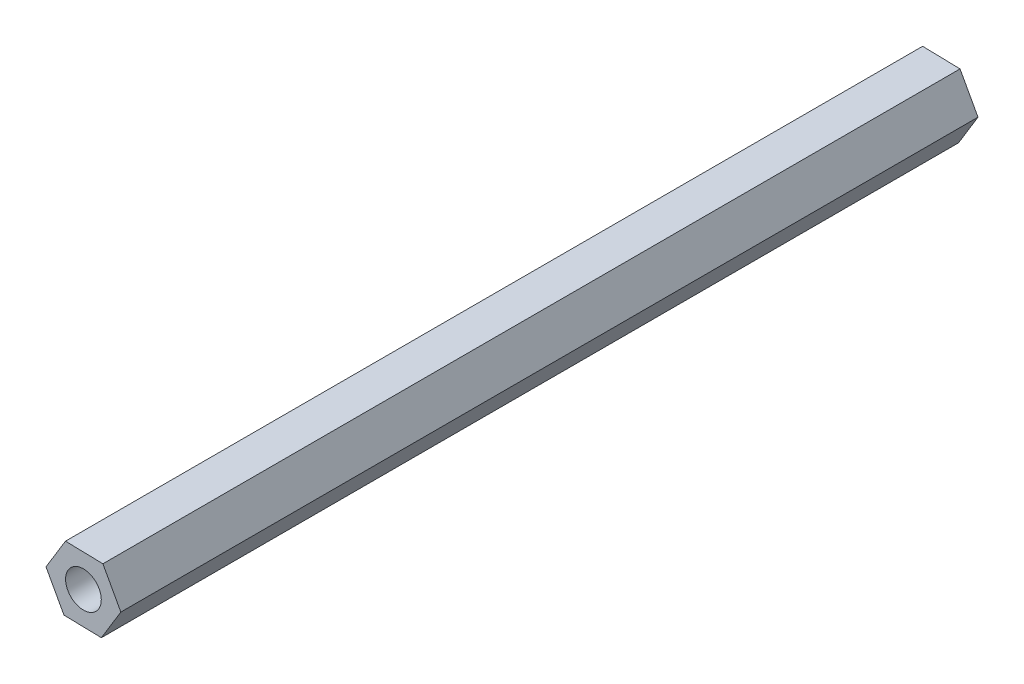
ISO-10303-21;
HEADER;
FILE_DESCRIPTION(('STEP AP214'),'2;1');
FILE_NAME('part.step','',(''),(''),'','','');
FILE_SCHEMA(('AUTOMOTIVE_DESIGN { 1 0 10303 214 1 1 1 1 }'));
ENDSEC;
DATA;
#1=APPLICATION_CONTEXT('core data for automotive mechanical design processes');
#2=APPLICATION_PROTOCOL_DEFINITION('international standard','automotive_design',2000,#1);
#3=PRODUCT_CONTEXT('',#1,'mechanical');
#4=PRODUCT('Part','Part','',(#3));
#5=PRODUCT_RELATED_PRODUCT_CATEGORY('part','',(#4));
#6=PRODUCT_DEFINITION_FORMATION('','',#4);
#7=PRODUCT_DEFINITION_CONTEXT('part definition',#1,'design');
#8=PRODUCT_DEFINITION('design','',#6,#7);
#9=PRODUCT_DEFINITION_SHAPE('','',#8);
#10=(LENGTH_UNIT() NAMED_UNIT(*) SI_UNIT(.MILLI.,.METRE.));
#11=(NAMED_UNIT(*) PLANE_ANGLE_UNIT() SI_UNIT($,.RADIAN.));
#12=(NAMED_UNIT(*) SI_UNIT($,.STERADIAN.) SOLID_ANGLE_UNIT());
#13=UNCERTAINTY_MEASURE_WITH_UNIT(LENGTH_MEASURE(1.E-05),#10,'distance_accuracy_value','');
#14=(GEOMETRIC_REPRESENTATION_CONTEXT(3) GLOBAL_UNCERTAINTY_ASSIGNED_CONTEXT((#13)) GLOBAL_UNIT_ASSIGNED_CONTEXT((#10,
#11,#12)) REPRESENTATION_CONTEXT('',''));
#15=CARTESIAN_POINT('',(0.,0.,0.));
#16=DIRECTION('',(0.,0.,1.));
#17=DIRECTION('',(1.,0.,0.));
#18=AXIS2_PLACEMENT_3D('',#15,#16,#17);
#19=CARTESIAN_POINT('',(2.61926978889612,-0.0618528332097781,60.));
#20=DIRECTION('',(-0.877588012654211,-0.47941556091311,0.));
#21=DIRECTION('',(0.47941556091311,-0.877588012654211,0.));
#22=AXIS2_PLACEMENT_3D('',#19,#20,#21);
#23=PLANE('',#22);
#24=DIRECTION('',(-0.47941556091311,0.877588012654211,0.));
#25=VECTOR('',#24,1.);
#26=CARTESIAN_POINT('',(2.61926978889612,-0.0618528332097781,0.));
#27=LINE('',#26,#25);
#28=CARTESIAN_POINT('',(2.61926978889612,-0.0618528332097781,0.));
#29=VERTEX_POINT('',#28);
#30=CARTESIAN_POINT('',(1.36320101930377,2.23742775994426,0.));
#31=VERTEX_POINT('',#30);
#32=EDGE_CURVE('E125',#29,#31,#27,.T.);
#33=ORIENTED_EDGE('',*,*,#32,.T.);
#34=DIRECTION('',(0.,0.,-1.));
#35=VECTOR('',#34,1.);
#36=CARTESIAN_POINT('',(1.36320101930377,2.23742775994426,60.));
#37=LINE('',#36,#35);
#38=CARTESIAN_POINT('',(1.36320101930377,2.23742775994426,60.));
#39=VERTEX_POINT('',#38);
#40=EDGE_CURVE('E11',#39,#31,#37,.T.);
#41=ORIENTED_EDGE('',*,*,#40,.F.);
#42=DIRECTION('',(-0.47941556091311,0.877588012654211,0.));
#43=VECTOR('',#42,1.);
#44=CARTESIAN_POINT('',(2.61926978889612,-0.0618528332097781,60.));
#45=LINE('',#44,#43);
#46=CARTESIAN_POINT('',(2.61926978889612,-0.0618528332097781,60.));
#47=VERTEX_POINT('',#46);
#48=EDGE_CURVE('E136',#47,#39,#45,.T.);
#49=ORIENTED_EDGE('',*,*,#48,.F.);
#50=DIRECTION('',(0.,0.,-1.));
#51=VECTOR('',#50,1.);
#52=CARTESIAN_POINT('',(2.61926978889612,-0.0618528332097781,60.));
#53=LINE('',#52,#51);
#54=EDGE_CURVE('E121',#47,#29,#53,.T.);
#55=ORIENTED_EDGE('',*,*,#54,.T.);
#56=EDGE_LOOP('',(#33,#41,#49,#55));
#57=FACE_BOUND('',#56,.T.);
#58=ADVANCED_FACE('F38',(#57),#23,.F.);
#59=CARTESIAN_POINT('',(1.36320101930377,2.23742775994426,60.));
#60=DIRECTION('',(-0.023607951606785,-0.999721293471801,0.));
#61=DIRECTION('',(0.999721293471801,-0.023607951606785,0.));
#62=AXIS2_PLACEMENT_3D('',#59,#60,#61);
#63=PLANE('',#62);
#64=DIRECTION('',(-0.999721293471801,0.023607951606785,0.));
#65=VECTOR('',#64,1.);
#66=CARTESIAN_POINT('',(1.36320101930377,2.23742775994426,0.));
#67=LINE('',#66,#65);
#68=CARTESIAN_POINT('',(-1.25606876959235,2.29928059315403,0.));
#69=VERTEX_POINT('',#68);
#70=EDGE_CURVE('E128',#31,#69,#67,.T.);
#71=ORIENTED_EDGE('',*,*,#70,.T.);
#72=DIRECTION('',(0.,0.,-1.));
#73=VECTOR('',#72,1.);
#74=CARTESIAN_POINT('',(-1.25606876959235,2.29928059315403,60.));
#75=LINE('',#74,#73);
#76=CARTESIAN_POINT('',(-1.25606876959235,2.29928059315403,60.));
#77=VERTEX_POINT('',#76);
#78=EDGE_CURVE('E46',#77,#69,#75,.T.);
#79=ORIENTED_EDGE('',*,*,#78,.F.);
#80=DIRECTION('',(-0.999721293471801,0.023607951606785,0.));
#81=VECTOR('',#80,1.);
#82=CARTESIAN_POINT('',(1.36320101930377,2.23742775994426,60.));
#83=LINE('',#82,#81);
#84=EDGE_CURVE('E92',#39,#77,#83,.T.);
#85=ORIENTED_EDGE('',*,*,#84,.F.);
#86=ORIENTED_EDGE('',*,*,#40,.T.);
#87=EDGE_LOOP('',(#71,#79,#85,#86));
#88=FACE_BOUND('',#87,.T.);
#89=ADVANCED_FACE('F161',(#88),#63,.F.);
#90=CARTESIAN_POINT('',(-1.25606876959235,2.29928059315403,60.));
#91=DIRECTION('',(0.853980061047426,-0.52030573255869,0.));
#92=DIRECTION('',(0.52030573255869,0.853980061047426,0.));
#93=AXIS2_PLACEMENT_3D('',#90,#91,#92);
#94=PLANE('',#93);
#95=DIRECTION('',(-0.52030573255869,-0.853980061047426,0.));
#96=VECTOR('',#95,1.);
#97=CARTESIAN_POINT('',(-1.25606876959235,2.29928059315403,0.));
#98=LINE('',#97,#96);
#99=CARTESIAN_POINT('',(-2.61926978889612,0.0618528332097761,0.));
#100=VERTEX_POINT('',#99);
#101=EDGE_CURVE('E131',#69,#100,#98,.T.);
#102=ORIENTED_EDGE('',*,*,#101,.T.);
#103=DIRECTION('',(0.,0.,-1.));
#104=VECTOR('',#103,1.);
#105=CARTESIAN_POINT('',(-2.61926978889612,0.0618528332097761,60.));
#106=LINE('',#105,#104);
#107=CARTESIAN_POINT('',(-2.61926978889612,0.0618528332097761,60.));
#108=VERTEX_POINT('',#107);
#109=EDGE_CURVE('E116',#108,#100,#106,.T.);
#110=ORIENTED_EDGE('',*,*,#109,.F.);
#111=DIRECTION('',(-0.52030573255869,-0.853980061047426,0.));
#112=VECTOR('',#111,1.);
#113=CARTESIAN_POINT('',(-1.25606876959235,2.29928059315403,60.));
#114=LINE('',#113,#112);
#115=EDGE_CURVE('E107',#77,#108,#114,.T.);
#116=ORIENTED_EDGE('',*,*,#115,.F.);
#117=ORIENTED_EDGE('',*,*,#78,.T.);
#118=EDGE_LOOP('',(#102,#110,#116,#117));
#119=FACE_BOUND('',#118,.T.);
#120=ADVANCED_FACE('F142',(#119),#94,.F.);
#121=CARTESIAN_POINT('',(-2.61926978889612,0.0618528332097761,60.));
#122=DIRECTION('',(0.877588012654211,0.479415560913111,0.));
#123=DIRECTION('',(-0.479415560913111,0.877588012654211,0.));
#124=AXIS2_PLACEMENT_3D('',#121,#122,#123);
#125=PLANE('',#124);
#126=DIRECTION('',(0.479415560913111,-0.877588012654211,0.));
#127=VECTOR('',#126,1.);
#128=CARTESIAN_POINT('',(-2.61926978889612,0.0618528332097761,0.));
#129=LINE('',#128,#127);
#130=CARTESIAN_POINT('',(-1.36320101930377,-2.23742775994425,0.));
#131=VERTEX_POINT('',#130);
#132=EDGE_CURVE('E115',#100,#131,#129,.T.);
#133=ORIENTED_EDGE('',*,*,#132,.T.);
#134=DIRECTION('',(0.,0.,-1.));
#135=VECTOR('',#134,1.);
#136=CARTESIAN_POINT('',(-1.36320101930377,-2.23742775994425,60.));
#137=LINE('',#136,#135);
#138=CARTESIAN_POINT('',(-1.36320101930377,-2.23742775994425,60.));
#139=VERTEX_POINT('',#138);
#140=EDGE_CURVE('E112',#139,#131,#137,.T.);
#141=ORIENTED_EDGE('',*,*,#140,.F.);
#142=DIRECTION('',(0.479415560913111,-0.877588012654211,0.));
#143=VECTOR('',#142,1.);
#144=CARTESIAN_POINT('',(-2.61926978889612,0.0618528332097761,60.));
#145=LINE('',#144,#143);
#146=EDGE_CURVE('E101',#108,#139,#145,.T.);
#147=ORIENTED_EDGE('',*,*,#146,.F.);
#148=ORIENTED_EDGE('',*,*,#109,.T.);
#149=EDGE_LOOP('',(#133,#141,#147,#148));
#150=FACE_BOUND('',#149,.T.);
#151=ADVANCED_FACE('F113',(#150),#125,.F.);
#152=CARTESIAN_POINT('',(-1.36320101930377,-2.23742775994425,60.));
#153=DIRECTION('',(0.023607951606785,0.999721293471801,0.));
#154=DIRECTION('',(-0.999721293471801,0.023607951606785,0.));
#155=AXIS2_PLACEMENT_3D('',#152,#153,#154);
#156=PLANE('',#155);
#157=DIRECTION('',(0.999721293471801,-0.023607951606785,0.));
#158=VECTOR('',#157,1.);
#159=CARTESIAN_POINT('',(-1.36320101930377,-2.23742775994425,0.));
#160=LINE('',#159,#158);
#161=CARTESIAN_POINT('',(1.25606876959235,-2.29928059315403,0.));
#162=VERTEX_POINT('',#161);
#163=EDGE_CURVE('E78',#131,#162,#160,.T.);
#164=ORIENTED_EDGE('',*,*,#163,.T.);
#165=DIRECTION('',(0.,0.,-1.));
#166=VECTOR('',#165,1.);
#167=CARTESIAN_POINT('',(1.25606876959235,-2.29928059315403,60.));
#168=LINE('',#167,#166);
#169=CARTESIAN_POINT('',(1.25606876959235,-2.29928059315403,60.));
#170=VERTEX_POINT('',#169);
#171=EDGE_CURVE('E117',#170,#162,#168,.T.);
#172=ORIENTED_EDGE('',*,*,#171,.F.);
#173=DIRECTION('',(0.999721293471801,-0.023607951606785,0.));
#174=VECTOR('',#173,1.);
#175=CARTESIAN_POINT('',(-1.36320101930377,-2.23742775994425,60.));
#176=LINE('',#175,#174);
#177=EDGE_CURVE('E105',#139,#170,#176,.T.);
#178=ORIENTED_EDGE('',*,*,#177,.F.);
#179=ORIENTED_EDGE('',*,*,#140,.T.);
#180=EDGE_LOOP('',(#164,#172,#178,#179));
#181=FACE_BOUND('',#180,.T.);
#182=ADVANCED_FACE('F119',(#181),#156,.F.);
#183=CARTESIAN_POINT('',(1.25606876959235,-2.29928059315403,60.));
#184=DIRECTION('',(-0.853980061047425,0.520305732558691,0.));
#185=DIRECTION('',(-0.520305732558691,-0.853980061047425,0.));
#186=AXIS2_PLACEMENT_3D('',#183,#184,#185);
#187=PLANE('',#186);
#188=DIRECTION('',(0.520305732558691,0.853980061047425,0.));
#189=VECTOR('',#188,1.);
#190=CARTESIAN_POINT('',(1.25606876959235,-2.29928059315403,0.));
#191=LINE('',#190,#189);
#192=EDGE_CURVE('E84',#162,#29,#191,.T.);
#193=ORIENTED_EDGE('',*,*,#192,.T.);
#194=ORIENTED_EDGE('',*,*,#54,.F.);
#195=DIRECTION('',(0.520305732558691,0.853980061047425,0.));
#196=VECTOR('',#195,1.);
#197=CARTESIAN_POINT('',(1.25606876959235,-2.29928059315403,60.));
#198=LINE('',#197,#196);
#199=EDGE_CURVE('E54',#170,#47,#198,.T.);
#200=ORIENTED_EDGE('',*,*,#199,.F.);
#201=ORIENTED_EDGE('',*,*,#171,.T.);
#202=EDGE_LOOP('',(#193,#194,#200,#201));
#203=FACE_BOUND('',#202,.T.);
#204=ADVANCED_FACE('F149',(#203),#187,.F.);
#205=CARTESIAN_POINT('',(0.,0.,60.));
#206=DIRECTION('',(0.,0.,1.));
#207=DIRECTION('',(1.,0.,0.));
#208=AXIS2_PLACEMENT_3D('',#205,#206,#207);
#209=PLANE('',#208);
#210=CARTESIAN_POINT('',(0.,0.,60.));
#211=DIRECTION('',(0.,0.,1.));
#212=DIRECTION('',(1.,0.,0.));
#213=AXIS2_PLACEMENT_3D('',#210,#211,#212);
#214=CIRCLE('',#213,1.24999999999999);
#215=CARTESIAN_POINT('',(1.24999999999999,0.,60.));
#216=VERTEX_POINT('',#215);
#217=EDGE_CURVE('E257',#216,#216,#214,.T.);
#218=ORIENTED_EDGE('',*,*,#217,.F.);
#219=EDGE_LOOP('',(#218));
#220=FACE_BOUND('',#219,.T.);
#221=ORIENTED_EDGE('',*,*,#48,.T.);
#222=ORIENTED_EDGE('',*,*,#84,.T.);
#223=ORIENTED_EDGE('',*,*,#115,.T.);
#224=ORIENTED_EDGE('',*,*,#146,.T.);
#225=ORIENTED_EDGE('',*,*,#177,.T.);
#226=ORIENTED_EDGE('',*,*,#199,.T.);
#227=EDGE_LOOP('',(#221,#222,#223,#224,#225,#226));
#228=FACE_BOUND('',#227,.T.);
#229=ADVANCED_FACE('F103',(#220,#228),#209,.T.);
#230=CARTESIAN_POINT('',(0.,0.,0.));
#231=DIRECTION('',(0.,0.,1.));
#232=DIRECTION('',(1.,0.,0.));
#233=AXIS2_PLACEMENT_3D('',#230,#231,#232);
#234=PLANE('',#233);
#235=CARTESIAN_POINT('',(0.,0.,0.));
#236=DIRECTION('',(0.,0.,-1.));
#237=DIRECTION('',(-1.,0.,0.));
#238=AXIS2_PLACEMENT_3D('',#235,#236,#237);
#239=CIRCLE('',#238,1.24999999999999);
#240=CARTESIAN_POINT('',(-1.24999999999999,0.,0.));
#241=VERTEX_POINT('',#240);
#242=EDGE_CURVE('E255',#241,#241,#239,.T.);
#243=ORIENTED_EDGE('',*,*,#242,.F.);
#244=EDGE_LOOP('',(#243));
#245=FACE_BOUND('',#244,.T.);
#246=ORIENTED_EDGE('',*,*,#32,.F.);
#247=ORIENTED_EDGE('',*,*,#192,.F.);
#248=ORIENTED_EDGE('',*,*,#163,.F.);
#249=ORIENTED_EDGE('',*,*,#132,.F.);
#250=ORIENTED_EDGE('',*,*,#101,.F.);
#251=ORIENTED_EDGE('',*,*,#70,.F.);
#252=EDGE_LOOP('',(#246,#247,#248,#249,#250,#251));
#253=FACE_BOUND('',#252,.T.);
#254=ADVANCED_FACE('F145',(#245,#253),#234,.F.);
#255=CARTESIAN_POINT('',(0.,0.,45.));
#256=DIRECTION('',(0.,0.,1.));
#257=DIRECTION('',(1.,0.,0.));
#258=AXIS2_PLACEMENT_3D('',#255,#256,#257);
#259=CONICAL_SURFACE('',#258,1.25,1.02974425867665);
#260=CARTESIAN_POINT('',(0.,0.,44.2489242262155));
#261=VERTEX_POINT('',#260);
#262=VERTEX_LOOP('',#261);
#263=FACE_BOUND('',#262,.T.);
#264=CARTESIAN_POINT('',(0.,0.,45.));
#265=DIRECTION('',(0.,0.,1.));
#266=DIRECTION('',(1.,0.,0.));
#267=AXIS2_PLACEMENT_3D('',#264,#265,#266);
#268=CIRCLE('',#267,1.25);
#269=CARTESIAN_POINT('',(1.25,0.,45.));
#270=VERTEX_POINT('',#269);
#271=EDGE_CURVE('E129',#270,#270,#268,.T.);
#272=ORIENTED_EDGE('',*,*,#271,.T.);
#273=EDGE_LOOP('',(#272));
#274=FACE_BOUND('',#273,.T.);
#275=ADVANCED_FACE('F196',(#263,#274),#259,.F.);
#276=CARTESIAN_POINT('',(0.,0.,60.));
#277=DIRECTION('',(0.,0.,1.));
#278=DIRECTION('',(1.,0.,0.));
#279=AXIS2_PLACEMENT_3D('',#276,#277,#278);
#280=CYLINDRICAL_SURFACE('',#279,1.24999999999999);
#281=ORIENTED_EDGE('',*,*,#271,.F.);
#282=EDGE_LOOP('',(#281));
#283=FACE_BOUND('',#282,.T.);
#284=ORIENTED_EDGE('',*,*,#217,.T.);
#285=EDGE_LOOP('',(#284));
#286=FACE_BOUND('',#285,.T.);
#287=ADVANCED_FACE('F201',(#283,#286),#280,.F.);
#288=CARTESIAN_POINT('',(0.,0.,15.));
#289=DIRECTION('',(0.,0.,-1.));
#290=DIRECTION('',(-1.,0.,0.));
#291=AXIS2_PLACEMENT_3D('',#288,#289,#290);
#292=CONICAL_SURFACE('',#291,1.24999999999999,1.02974425867665);
#293=CARTESIAN_POINT('',(0.,0.,15.7510757737845));
#294=VERTEX_POINT('',#293);
#295=VERTEX_LOOP('',#294);
#296=FACE_BOUND('',#295,.T.);
#297=CARTESIAN_POINT('',(0.,0.,15.));
#298=DIRECTION('',(0.,0.,-1.));
#299=DIRECTION('',(-1.,0.,0.));
#300=AXIS2_PLACEMENT_3D('',#297,#298,#299);
#301=CIRCLE('',#300,1.24999999999999);
#302=CARTESIAN_POINT('',(-1.24999999999999,0.,15.));
#303=VERTEX_POINT('',#302);
#304=EDGE_CURVE('E252',#303,#303,#301,.T.);
#305=ORIENTED_EDGE('',*,*,#304,.T.);
#306=EDGE_LOOP('',(#305));
#307=FACE_BOUND('',#306,.T.);
#308=ADVANCED_FACE('F212',(#296,#307),#292,.F.);
#309=CARTESIAN_POINT('',(0.,0.,0.));
#310=DIRECTION('',(0.,0.,-1.));
#311=DIRECTION('',(-1.,0.,0.));
#312=AXIS2_PLACEMENT_3D('',#309,#310,#311);
#313=CYLINDRICAL_SURFACE('',#312,1.24999999999999);
#314=ORIENTED_EDGE('',*,*,#304,.F.);
#315=EDGE_LOOP('',(#314));
#316=FACE_BOUND('',#315,.T.);
#317=ORIENTED_EDGE('',*,*,#242,.T.);
#318=EDGE_LOOP('',(#317));
#319=FACE_BOUND('',#318,.T.);
#320=ADVANCED_FACE('F230',(#316,#319),#313,.F.);
#321=CLOSED_SHELL('',(#58,#89,#120,#151,#182,#204,#229,#254,#275,#287,#308,#320));
#322=MANIFOLD_SOLID_BREP('B2',#321);
#323=ADVANCED_BREP_SHAPE_REPRESENTATION('',(#18,#322),#14);
#324=SHAPE_DEFINITION_REPRESENTATION(#9,#323);
ENDSEC;
END-ISO-10303-21;
